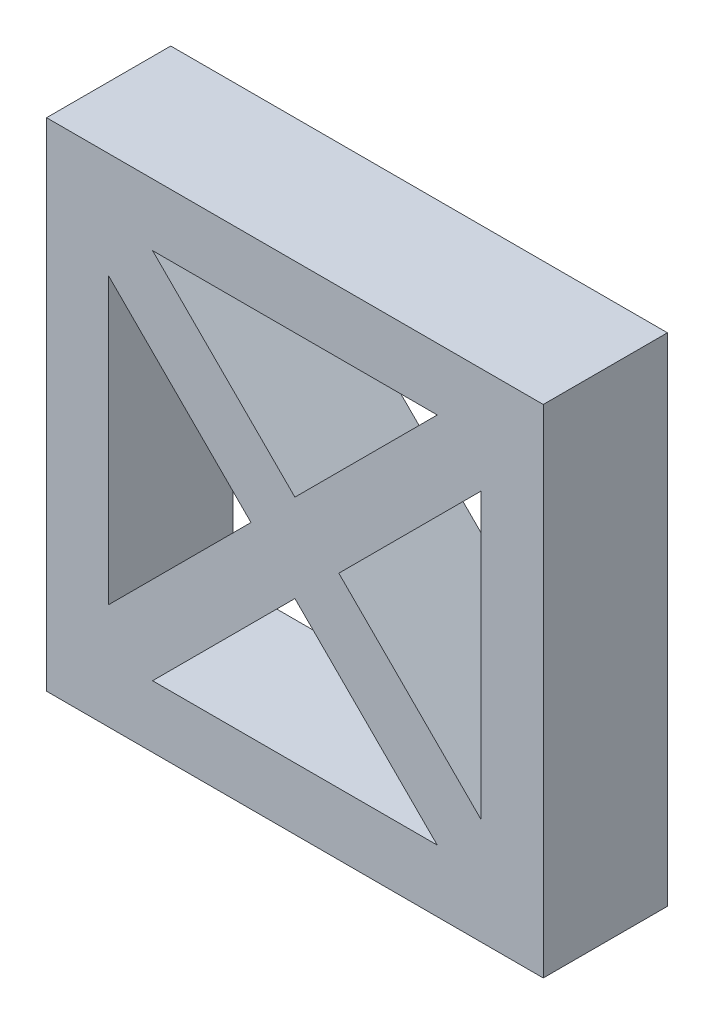
ISO-10303-21;
HEADER;
FILE_DESCRIPTION(('STEP AP214'),'2;1');
FILE_NAME('part.step','',(''),(''),'','','');
FILE_SCHEMA(('AUTOMOTIVE_DESIGN { 1 0 10303 214 1 1 1 1 }'));
ENDSEC;
DATA;
#1=APPLICATION_CONTEXT('core data for automotive mechanical design processes');
#2=APPLICATION_PROTOCOL_DEFINITION('international standard','automotive_design',2000,#1);
#3=PRODUCT_CONTEXT('',#1,'mechanical');
#4=PRODUCT('Part','Part','',(#3));
#5=PRODUCT_RELATED_PRODUCT_CATEGORY('part','',(#4));
#6=PRODUCT_DEFINITION_FORMATION('','',#4);
#7=PRODUCT_DEFINITION_CONTEXT('part definition',#1,'design');
#8=PRODUCT_DEFINITION('design','',#6,#7);
#9=PRODUCT_DEFINITION_SHAPE('','',#8);
#10=(LENGTH_UNIT() NAMED_UNIT(*) SI_UNIT(.MILLI.,.METRE.));
#11=(NAMED_UNIT(*) PLANE_ANGLE_UNIT() SI_UNIT($,.RADIAN.));
#12=(NAMED_UNIT(*) SI_UNIT($,.STERADIAN.) SOLID_ANGLE_UNIT());
#13=UNCERTAINTY_MEASURE_WITH_UNIT(LENGTH_MEASURE(1.E-05),#10,'distance_accuracy_value','');
#14=(GEOMETRIC_REPRESENTATION_CONTEXT(3) GLOBAL_UNCERTAINTY_ASSIGNED_CONTEXT((#13)) GLOBAL_UNIT_ASSIGNED_CONTEXT((#10,
#11,#12)) REPRESENTATION_CONTEXT('',''));
#15=CARTESIAN_POINT('',(0.,0.,0.));
#16=DIRECTION('',(0.,0.,1.));
#17=DIRECTION('',(1.,0.,0.));
#18=AXIS2_PLACEMENT_3D('',#15,#16,#17);
#19=CARTESIAN_POINT('',(0.,0.,10.));
#20=DIRECTION('',(0.,1.,0.));
#21=DIRECTION('',(0.,0.,1.));
#22=AXIS2_PLACEMENT_3D('',#19,#20,#21);
#23=PLANE('',#22);
#24=DIRECTION('',(1.,0.,0.));
#25=VECTOR('',#24,1.);
#26=CARTESIAN_POINT('',(0.,0.,0.));
#27=LINE('',#26,#25);
#28=CARTESIAN_POINT('',(0.,0.,0.));
#29=VERTEX_POINT('',#28);
#30=CARTESIAN_POINT('',(40.,0.,0.));
#31=VERTEX_POINT('',#30);
#32=EDGE_CURVE('E212',#29,#31,#27,.T.);
#33=ORIENTED_EDGE('',*,*,#32,.T.);
#34=DIRECTION('',(0.,0.,-1.));
#35=VECTOR('',#34,1.);
#36=CARTESIAN_POINT('',(40.,0.,10.));
#37=LINE('',#36,#35);
#38=CARTESIAN_POINT('',(40.,0.,10.));
#39=VERTEX_POINT('',#38);
#40=EDGE_CURVE('E11',#39,#31,#37,.T.);
#41=ORIENTED_EDGE('',*,*,#40,.F.);
#42=DIRECTION('',(1.,0.,0.));
#43=VECTOR('',#42,1.);
#44=CARTESIAN_POINT('',(0.,0.,10.));
#45=LINE('',#44,#43);
#46=CARTESIAN_POINT('',(0.,0.,10.));
#47=VERTEX_POINT('',#46);
#48=EDGE_CURVE('E160',#47,#39,#45,.T.);
#49=ORIENTED_EDGE('',*,*,#48,.F.);
#50=DIRECTION('',(0.,0.,-1.));
#51=VECTOR('',#50,1.);
#52=CARTESIAN_POINT('',(0.,0.,10.));
#53=LINE('',#52,#51);
#54=EDGE_CURVE('E52',#47,#29,#53,.T.);
#55=ORIENTED_EDGE('',*,*,#54,.T.);
#56=EDGE_LOOP('',(#33,#41,#49,#55));
#57=FACE_BOUND('',#56,.T.);
#58=ADVANCED_FACE('F33',(#57),#23,.F.);
#59=CARTESIAN_POINT('',(40.,0.,10.));
#60=DIRECTION('',(-1.,0.,0.));
#61=DIRECTION('',(0.,0.,1.));
#62=AXIS2_PLACEMENT_3D('',#59,#60,#61);
#63=PLANE('',#62);
#64=DIRECTION('',(0.,1.,0.));
#65=VECTOR('',#64,1.);
#66=CARTESIAN_POINT('',(40.,0.,0.));
#67=LINE('',#66,#65);
#68=CARTESIAN_POINT('',(40.,40.,0.));
#69=VERTEX_POINT('',#68);
#70=EDGE_CURVE('E166',#31,#69,#67,.T.);
#71=ORIENTED_EDGE('',*,*,#70,.T.);
#72=DIRECTION('',(0.,0.,-1.));
#73=VECTOR('',#72,1.);
#74=CARTESIAN_POINT('',(40.,40.,10.));
#75=LINE('',#74,#73);
#76=CARTESIAN_POINT('',(40.,40.,10.));
#77=VERTEX_POINT('',#76);
#78=EDGE_CURVE('E43',#77,#69,#75,.T.);
#79=ORIENTED_EDGE('',*,*,#78,.F.);
#80=DIRECTION('',(0.,1.,0.));
#81=VECTOR('',#80,1.);
#82=CARTESIAN_POINT('',(40.,0.,10.));
#83=LINE('',#82,#81);
#84=EDGE_CURVE('E154',#39,#77,#83,.T.);
#85=ORIENTED_EDGE('',*,*,#84,.F.);
#86=ORIENTED_EDGE('',*,*,#40,.T.);
#87=EDGE_LOOP('',(#71,#79,#85,#86));
#88=FACE_BOUND('',#87,.T.);
#89=ADVANCED_FACE('F165',(#88),#63,.F.);
#90=CARTESIAN_POINT('',(0.,40.,10.));
#91=DIRECTION('',(0.,1.,0.));
#92=DIRECTION('',(0.,0.,1.));
#93=AXIS2_PLACEMENT_3D('',#90,#91,#92);
#94=PLANE('',#93);
#95=DIRECTION('',(1.,0.,0.));
#96=VECTOR('',#95,1.);
#97=CARTESIAN_POINT('',(0.,40.,0.));
#98=LINE('',#97,#96);
#99=CARTESIAN_POINT('',(0.,40.,0.));
#100=VERTEX_POINT('',#99);
#101=EDGE_CURVE('E215',#100,#69,#98,.T.);
#102=ORIENTED_EDGE('',*,*,#101,.F.);
#103=DIRECTION('',(0.,0.,-1.));
#104=VECTOR('',#103,1.);
#105=CARTESIAN_POINT('',(0.,40.,10.));
#106=LINE('',#105,#104);
#107=CARTESIAN_POINT('',(0.,40.,10.));
#108=VERTEX_POINT('',#107);
#109=EDGE_CURVE('E102',#108,#100,#106,.T.);
#110=ORIENTED_EDGE('',*,*,#109,.F.);
#111=DIRECTION('',(1.,0.,0.));
#112=VECTOR('',#111,1.);
#113=CARTESIAN_POINT('',(0.,40.,10.));
#114=LINE('',#113,#112);
#115=EDGE_CURVE('E159',#108,#77,#114,.T.);
#116=ORIENTED_EDGE('',*,*,#115,.T.);
#117=ORIENTED_EDGE('',*,*,#78,.T.);
#118=EDGE_LOOP('',(#102,#110,#116,#117));
#119=FACE_BOUND('',#118,.T.);
#120=ADVANCED_FACE('F170',(#119),#94,.T.);
#121=CARTESIAN_POINT('',(18.2322330470336,18.2322330470336,10.));
#122=DIRECTION('',(0.707106781186547,0.707106781186548,0.));
#123=DIRECTION('',(-0.707106781186548,0.707106781186547,0.));
#124=AXIS2_PLACEMENT_3D('',#121,#122,#123);
#125=PLANE('',#124);
#126=DIRECTION('',(0.707106781186548,-0.707106781186547,0.));
#127=VECTOR('',#126,1.);
#128=CARTESIAN_POINT('',(18.2322330470336,18.2322330470336,0.));
#129=LINE('',#128,#127);
#130=CARTESIAN_POINT('',(4.99999999999999,31.4644660940673,0.));
#131=VERTEX_POINT('',#130);
#132=CARTESIAN_POINT('',(16.4644660940673,20.,0.));
#133=VERTEX_POINT('',#132);
#134=EDGE_CURVE('E203',#131,#133,#129,.T.);
#135=ORIENTED_EDGE('',*,*,#134,.T.);
#136=DIRECTION('',(0.,0.,-1.));
#137=VECTOR('',#136,1.);
#138=CARTESIAN_POINT('',(16.4644660940673,20.,10.));
#139=LINE('',#138,#137);
#140=CARTESIAN_POINT('',(16.4644660940673,20.,10.));
#141=VERTEX_POINT('',#140);
#142=EDGE_CURVE('E222',#141,#133,#139,.T.);
#143=ORIENTED_EDGE('',*,*,#142,.F.);
#144=DIRECTION('',(0.707106781186548,-0.707106781186547,0.));
#145=VECTOR('',#144,1.);
#146=CARTESIAN_POINT('',(18.2322330470336,18.2322330470336,10.));
#147=LINE('',#146,#145);
#148=CARTESIAN_POINT('',(4.99999999999999,31.4644660940673,10.));
#149=VERTEX_POINT('',#148);
#150=EDGE_CURVE('E279',#149,#141,#147,.T.);
#151=ORIENTED_EDGE('',*,*,#150,.F.);
#152=DIRECTION('',(0.,0.,-1.));
#153=VECTOR('',#152,1.);
#154=CARTESIAN_POINT('',(4.99999999999999,31.4644660940673,10.));
#155=LINE('',#154,#153);
#156=EDGE_CURVE('E224',#149,#131,#155,.T.);
#157=ORIENTED_EDGE('',*,*,#156,.T.);
#158=EDGE_LOOP('',(#135,#143,#151,#157));
#159=FACE_BOUND('',#158,.T.);
#160=ADVANCED_FACE('F300',(#159),#125,.F.);
#161=CARTESIAN_POINT('',(-1.76776695296637,1.76776695296637,10.));
#162=DIRECTION('',(0.707106781186548,-0.707106781186548,0.));
#163=DIRECTION('',(0.707106781186548,0.707106781186548,0.));
#164=AXIS2_PLACEMENT_3D('',#161,#162,#163);
#165=PLANE('',#164);
#166=DIRECTION('',(-0.707106781186548,-0.707106781186548,0.));
#167=VECTOR('',#166,1.);
#168=CARTESIAN_POINT('',(-1.76776695296637,1.76776695296637,0.));
#169=LINE('',#168,#167);
#170=CARTESIAN_POINT('',(4.99999999999999,8.53553390593273,0.));
#171=VERTEX_POINT('',#170);
#172=EDGE_CURVE('E206',#133,#171,#169,.T.);
#173=ORIENTED_EDGE('',*,*,#172,.T.);
#174=DIRECTION('',(0.,0.,-1.));
#175=VECTOR('',#174,1.);
#176=CARTESIAN_POINT('',(4.99999999999999,8.53553390593273,10.));
#177=LINE('',#176,#175);
#178=CARTESIAN_POINT('',(4.99999999999999,8.53553390593273,10.));
#179=VERTEX_POINT('',#178);
#180=EDGE_CURVE('E226',#179,#171,#177,.T.);
#181=ORIENTED_EDGE('',*,*,#180,.F.);
#182=DIRECTION('',(-0.707106781186548,-0.707106781186548,0.));
#183=VECTOR('',#182,1.);
#184=CARTESIAN_POINT('',(-1.76776695296637,1.76776695296637,10.));
#185=LINE('',#184,#183);
#186=EDGE_CURVE('E282',#141,#179,#185,.T.);
#187=ORIENTED_EDGE('',*,*,#186,.F.);
#188=ORIENTED_EDGE('',*,*,#142,.T.);
#189=EDGE_LOOP('',(#173,#181,#187,#188));
#190=FACE_BOUND('',#189,.T.);
#191=ADVANCED_FACE('F295',(#190),#165,.F.);
#192=CARTESIAN_POINT('',(-1.76776695296637,1.76776695296637,10.));
#193=DIRECTION('',(0.707106781186548,-0.707106781186548,0.));
#194=DIRECTION('',(0.707106781186548,0.707106781186548,0.));
#195=AXIS2_PLACEMENT_3D('',#192,#193,#194);
#196=PLANE('',#195);
#197=DIRECTION('',(-0.707106781186548,-0.707106781186548,0.));
#198=VECTOR('',#197,1.);
#199=CARTESIAN_POINT('',(-1.76776695296637,1.76776695296637,0.));
#200=LINE('',#199,#198);
#201=CARTESIAN_POINT('',(31.4644660940673,35.,0.));
#202=VERTEX_POINT('',#201);
#203=CARTESIAN_POINT('',(20.,23.5355339059327,0.));
#204=VERTEX_POINT('',#203);
#205=EDGE_CURVE('E195',#202,#204,#200,.T.);
#206=ORIENTED_EDGE('',*,*,#205,.T.);
#207=DIRECTION('',(0.,0.,-1.));
#208=VECTOR('',#207,1.);
#209=CARTESIAN_POINT('',(20.,23.5355339059327,10.));
#210=LINE('',#209,#208);
#211=CARTESIAN_POINT('',(20.,23.5355339059327,10.));
#212=VERTEX_POINT('',#211);
#213=EDGE_CURVE('E227',#212,#204,#210,.T.);
#214=ORIENTED_EDGE('',*,*,#213,.F.);
#215=DIRECTION('',(-0.707106781186548,-0.707106781186548,0.));
#216=VECTOR('',#215,1.);
#217=CARTESIAN_POINT('',(-1.76776695296637,1.76776695296637,10.));
#218=LINE('',#217,#216);
#219=CARTESIAN_POINT('',(31.4644660940673,35.,10.));
#220=VERTEX_POINT('',#219);
#221=EDGE_CURVE('E272',#220,#212,#218,.T.);
#222=ORIENTED_EDGE('',*,*,#221,.F.);
#223=DIRECTION('',(0.,0.,-1.));
#224=VECTOR('',#223,1.);
#225=CARTESIAN_POINT('',(31.4644660940673,35.,10.));
#226=LINE('',#225,#224);
#227=EDGE_CURVE('E231',#220,#202,#226,.T.);
#228=ORIENTED_EDGE('',*,*,#227,.T.);
#229=EDGE_LOOP('',(#206,#214,#222,#228));
#230=FACE_BOUND('',#229,.T.);
#231=ADVANCED_FACE('F307',(#230),#196,.F.);
#232=CARTESIAN_POINT('',(21.7677669529664,21.7677669529664,10.));
#233=DIRECTION('',(0.707106781186547,0.707106781186548,0.));
#234=DIRECTION('',(-0.707106781186548,0.707106781186547,0.));
#235=AXIS2_PLACEMENT_3D('',#232,#233,#234);
#236=PLANE('',#235);
#237=DIRECTION('',(0.707106781186548,-0.707106781186547,0.));
#238=VECTOR('',#237,1.);
#239=CARTESIAN_POINT('',(21.7677669529664,21.7677669529664,0.));
#240=LINE('',#239,#238);
#241=CARTESIAN_POINT('',(8.53553390593273,35.,0.));
#242=VERTEX_POINT('',#241);
#243=EDGE_CURVE('E198',#242,#204,#240,.T.);
#244=ORIENTED_EDGE('',*,*,#243,.F.);
#245=DIRECTION('',(0.,0.,-1.));
#246=VECTOR('',#245,1.);
#247=CARTESIAN_POINT('',(8.53553390593273,35.,10.));
#248=LINE('',#247,#246);
#249=CARTESIAN_POINT('',(8.53553390593273,35.,10.));
#250=VERTEX_POINT('',#249);
#251=EDGE_CURVE('E234',#250,#242,#248,.T.);
#252=ORIENTED_EDGE('',*,*,#251,.F.);
#253=DIRECTION('',(0.707106781186548,-0.707106781186547,0.));
#254=VECTOR('',#253,1.);
#255=CARTESIAN_POINT('',(21.7677669529664,21.7677669529664,10.));
#256=LINE('',#255,#254);
#257=EDGE_CURVE('E274',#250,#212,#256,.T.);
#258=ORIENTED_EDGE('',*,*,#257,.T.);
#259=ORIENTED_EDGE('',*,*,#213,.T.);
#260=EDGE_LOOP('',(#244,#252,#258,#259));
#261=FACE_BOUND('',#260,.T.);
#262=ADVANCED_FACE('F337',(#261),#236,.T.);
#263=CARTESIAN_POINT('',(1.76776695296637,-1.76776695296637,10.));
#264=DIRECTION('',(0.707106781186548,-0.707106781186548,0.));
#265=DIRECTION('',(0.707106781186548,0.707106781186548,0.));
#266=AXIS2_PLACEMENT_3D('',#263,#264,#265);
#267=PLANE('',#266);
#268=DIRECTION('',(-0.707106781186548,-0.707106781186548,0.));
#269=VECTOR('',#268,1.);
#270=CARTESIAN_POINT('',(1.76776695296637,-1.76776695296637,0.));
#271=LINE('',#270,#269);
#272=CARTESIAN_POINT('',(20.,16.4644660940673,0.));
#273=VERTEX_POINT('',#272);
#274=CARTESIAN_POINT('',(8.53553390593273,4.99999999999999,0.));
#275=VERTEX_POINT('',#274);
#276=EDGE_CURVE('E186',#273,#275,#271,.T.);
#277=ORIENTED_EDGE('',*,*,#276,.F.);
#278=DIRECTION('',(0.,0.,-1.));
#279=VECTOR('',#278,1.);
#280=CARTESIAN_POINT('',(20.,16.4644660940673,10.));
#281=LINE('',#280,#279);
#282=CARTESIAN_POINT('',(20.,16.4644660940673,10.));
#283=VERTEX_POINT('',#282);
#284=EDGE_CURVE('E235',#283,#273,#281,.T.);
#285=ORIENTED_EDGE('',*,*,#284,.F.);
#286=DIRECTION('',(-0.707106781186548,-0.707106781186548,0.));
#287=VECTOR('',#286,1.);
#288=CARTESIAN_POINT('',(1.76776695296637,-1.76776695296637,10.));
#289=LINE('',#288,#287);
#290=CARTESIAN_POINT('',(8.53553390593273,4.99999999999999,10.));
#291=VERTEX_POINT('',#290);
#292=EDGE_CURVE('E264',#283,#291,#289,.T.);
#293=ORIENTED_EDGE('',*,*,#292,.T.);
#294=DIRECTION('',(0.,0.,-1.));
#295=VECTOR('',#294,1.);
#296=CARTESIAN_POINT('',(8.53553390593273,4.99999999999999,10.));
#297=LINE('',#296,#295);
#298=EDGE_CURVE('E238',#291,#275,#297,.T.);
#299=ORIENTED_EDGE('',*,*,#298,.T.);
#300=EDGE_LOOP('',(#277,#285,#293,#299));
#301=FACE_BOUND('',#300,.T.);
#302=ADVANCED_FACE('F334',(#301),#267,.T.);
#303=CARTESIAN_POINT('',(18.2322330470336,18.2322330470336,10.));
#304=DIRECTION('',(0.707106781186547,0.707106781186548,0.));
#305=DIRECTION('',(-0.707106781186548,0.707106781186547,0.));
#306=AXIS2_PLACEMENT_3D('',#303,#304,#305);
#307=PLANE('',#306);
#308=DIRECTION('',(0.707106781186548,-0.707106781186547,0.));
#309=VECTOR('',#308,1.);
#310=CARTESIAN_POINT('',(18.2322330470336,18.2322330470336,0.));
#311=LINE('',#310,#309);
#312=CARTESIAN_POINT('',(31.4644660940673,4.99999999999999,0.));
#313=VERTEX_POINT('',#312);
#314=EDGE_CURVE('E189',#273,#313,#311,.T.);
#315=ORIENTED_EDGE('',*,*,#314,.T.);
#316=DIRECTION('',(0.,0.,-1.));
#317=VECTOR('',#316,1.);
#318=CARTESIAN_POINT('',(31.4644660940673,4.99999999999999,10.));
#319=LINE('',#318,#317);
#320=CARTESIAN_POINT('',(31.4644660940673,4.99999999999999,10.));
#321=VERTEX_POINT('',#320);
#322=EDGE_CURVE('E240',#321,#313,#319,.T.);
#323=ORIENTED_EDGE('',*,*,#322,.F.);
#324=DIRECTION('',(0.707106781186548,-0.707106781186547,0.));
#325=VECTOR('',#324,1.);
#326=CARTESIAN_POINT('',(18.2322330470336,18.2322330470336,10.));
#327=LINE('',#326,#325);
#328=EDGE_CURVE('E267',#283,#321,#327,.T.);
#329=ORIENTED_EDGE('',*,*,#328,.F.);
#330=ORIENTED_EDGE('',*,*,#284,.T.);
#331=EDGE_LOOP('',(#315,#323,#329,#330));
#332=FACE_BOUND('',#331,.T.);
#333=ADVANCED_FACE('F329',(#332),#307,.F.);
#334=CARTESIAN_POINT('',(21.7677669529664,21.7677669529664,10.));
#335=DIRECTION('',(0.707106781186547,0.707106781186548,0.));
#336=DIRECTION('',(-0.707106781186548,0.707106781186547,0.));
#337=AXIS2_PLACEMENT_3D('',#334,#335,#336);
#338=PLANE('',#337);
#339=DIRECTION('',(0.707106781186548,-0.707106781186547,0.));
#340=VECTOR('',#339,1.);
#341=CARTESIAN_POINT('',(21.7677669529664,21.7677669529664,0.));
#342=LINE('',#341,#340);
#343=CARTESIAN_POINT('',(23.5355339059327,20.,0.));
#344=VERTEX_POINT('',#343);
#345=CARTESIAN_POINT('',(35.,8.53553390593273,0.));
#346=VERTEX_POINT('',#345);
#347=EDGE_CURVE('E177',#344,#346,#342,.T.);
#348=ORIENTED_EDGE('',*,*,#347,.F.);
#349=DIRECTION('',(0.,0.,-1.));
#350=VECTOR('',#349,1.);
#351=CARTESIAN_POINT('',(23.5355339059327,20.,10.));
#352=LINE('',#351,#350);
#353=CARTESIAN_POINT('',(23.5355339059327,20.,10.));
#354=VERTEX_POINT('',#353);
#355=EDGE_CURVE('E37',#354,#344,#352,.T.);
#356=ORIENTED_EDGE('',*,*,#355,.F.);
#357=DIRECTION('',(0.707106781186548,-0.707106781186547,0.));
#358=VECTOR('',#357,1.);
#359=CARTESIAN_POINT('',(21.7677669529664,21.7677669529664,10.));
#360=LINE('',#359,#358);
#361=CARTESIAN_POINT('',(35.,8.53553390593273,10.));
#362=VERTEX_POINT('',#361);
#363=EDGE_CURVE('E220',#354,#362,#360,.T.);
#364=ORIENTED_EDGE('',*,*,#363,.T.);
#365=DIRECTION('',(0.,0.,-1.));
#366=VECTOR('',#365,1.);
#367=CARTESIAN_POINT('',(35.,8.53553390593273,10.));
#368=LINE('',#367,#366);
#369=EDGE_CURVE('E173',#362,#346,#368,.T.);
#370=ORIENTED_EDGE('',*,*,#369,.T.);
#371=EDGE_LOOP('',(#348,#356,#364,#370));
#372=FACE_BOUND('',#371,.T.);
#373=ADVANCED_FACE('F35',(#372),#338,.T.);
#374=CARTESIAN_POINT('',(1.76776695296637,-1.76776695296637,10.));
#375=DIRECTION('',(0.707106781186548,-0.707106781186548,0.));
#376=DIRECTION('',(0.707106781186548,0.707106781186548,0.));
#377=AXIS2_PLACEMENT_3D('',#374,#375,#376);
#378=PLANE('',#377);
#379=DIRECTION('',(-0.707106781186548,-0.707106781186548,0.));
#380=VECTOR('',#379,1.);
#381=CARTESIAN_POINT('',(1.76776695296637,-1.76776695296637,0.));
#382=LINE('',#381,#380);
#383=CARTESIAN_POINT('',(35.,31.4644660940673,0.));
#384=VERTEX_POINT('',#383);
#385=EDGE_CURVE('E180',#384,#344,#382,.T.);
#386=ORIENTED_EDGE('',*,*,#385,.F.);
#387=DIRECTION('',(0.,0.,-1.));
#388=VECTOR('',#387,1.);
#389=CARTESIAN_POINT('',(35.,31.4644660940673,10.));
#390=LINE('',#389,#388);
#391=CARTESIAN_POINT('',(35.,31.4644660940673,10.));
#392=VERTEX_POINT('',#391);
#393=EDGE_CURVE('E243',#392,#384,#390,.T.);
#394=ORIENTED_EDGE('',*,*,#393,.F.);
#395=DIRECTION('',(-0.707106781186548,-0.707106781186548,0.));
#396=VECTOR('',#395,1.);
#397=CARTESIAN_POINT('',(1.76776695296637,-1.76776695296637,10.));
#398=LINE('',#397,#396);
#399=EDGE_CURVE('E252',#392,#354,#398,.T.);
#400=ORIENTED_EDGE('',*,*,#399,.T.);
#401=ORIENTED_EDGE('',*,*,#355,.T.);
#402=EDGE_LOOP('',(#386,#394,#400,#401));
#403=FACE_BOUND('',#402,.T.);
#404=ADVANCED_FACE('F250',(#403),#378,.T.);
#405=CARTESIAN_POINT('',(4.99999999999999,0.,10.));
#406=DIRECTION('',(1.,0.,0.));
#407=DIRECTION('',(0.,0.,-1.));
#408=AXIS2_PLACEMENT_3D('',#405,#406,#407);
#409=PLANE('',#408);
#410=DIRECTION('',(0.,-1.,0.));
#411=VECTOR('',#410,1.);
#412=CARTESIAN_POINT('',(4.99999999999999,0.,0.));
#413=LINE('',#412,#411);
#414=EDGE_CURVE('E209',#131,#171,#413,.T.);
#415=ORIENTED_EDGE('',*,*,#414,.F.);
#416=ORIENTED_EDGE('',*,*,#156,.F.);
#417=DIRECTION('',(0.,-1.,0.));
#418=VECTOR('',#417,1.);
#419=CARTESIAN_POINT('',(4.99999999999999,0.,10.));
#420=LINE('',#419,#418);
#421=EDGE_CURVE('E284',#149,#179,#420,.T.);
#422=ORIENTED_EDGE('',*,*,#421,.T.);
#423=ORIENTED_EDGE('',*,*,#180,.T.);
#424=EDGE_LOOP('',(#415,#416,#422,#423));
#425=FACE_BOUND('',#424,.T.);
#426=ADVANCED_FACE('F289',(#425),#409,.T.);
#427=CARTESIAN_POINT('',(0.,35.,10.));
#428=DIRECTION('',(0.,1.,0.));
#429=DIRECTION('',(0.,0.,1.));
#430=AXIS2_PLACEMENT_3D('',#427,#428,#429);
#431=PLANE('',#430);
#432=DIRECTION('',(1.,0.,0.));
#433=VECTOR('',#432,1.);
#434=CARTESIAN_POINT('',(0.,35.,0.));
#435=LINE('',#434,#433);
#436=EDGE_CURVE('E201',#242,#202,#435,.T.);
#437=ORIENTED_EDGE('',*,*,#436,.T.);
#438=ORIENTED_EDGE('',*,*,#227,.F.);
#439=DIRECTION('',(1.,0.,0.));
#440=VECTOR('',#439,1.);
#441=CARTESIAN_POINT('',(0.,35.,10.));
#442=LINE('',#441,#440);
#443=EDGE_CURVE('E277',#250,#220,#442,.T.);
#444=ORIENTED_EDGE('',*,*,#443,.F.);
#445=ORIENTED_EDGE('',*,*,#251,.T.);
#446=EDGE_LOOP('',(#437,#438,#444,#445));
#447=FACE_BOUND('',#446,.T.);
#448=ADVANCED_FACE('F319',(#447),#431,.F.);
#449=CARTESIAN_POINT('',(0.,4.99999999999999,10.));
#450=DIRECTION('',(0.,1.,0.));
#451=DIRECTION('',(0.,0.,1.));
#452=AXIS2_PLACEMENT_3D('',#449,#450,#451);
#453=PLANE('',#452);
#454=DIRECTION('',(1.,0.,0.));
#455=VECTOR('',#454,1.);
#456=CARTESIAN_POINT('',(0.,4.99999999999999,0.));
#457=LINE('',#456,#455);
#458=EDGE_CURVE('E192',#275,#313,#457,.T.);
#459=ORIENTED_EDGE('',*,*,#458,.F.);
#460=ORIENTED_EDGE('',*,*,#298,.F.);
#461=DIRECTION('',(1.,0.,0.));
#462=VECTOR('',#461,1.);
#463=CARTESIAN_POINT('',(0.,4.99999999999999,10.));
#464=LINE('',#463,#462);
#465=EDGE_CURVE('E269',#291,#321,#464,.T.);
#466=ORIENTED_EDGE('',*,*,#465,.T.);
#467=ORIENTED_EDGE('',*,*,#322,.T.);
#468=EDGE_LOOP('',(#459,#460,#466,#467));
#469=FACE_BOUND('',#468,.T.);
#470=ADVANCED_FACE('F324',(#469),#453,.T.);
#471=CARTESIAN_POINT('',(35.,0.,10.));
#472=DIRECTION('',(1.,0.,0.));
#473=DIRECTION('',(0.,0.,-1.));
#474=AXIS2_PLACEMENT_3D('',#471,#472,#473);
#475=PLANE('',#474);
#476=DIRECTION('',(0.,-1.,0.));
#477=VECTOR('',#476,1.);
#478=CARTESIAN_POINT('',(35.,0.,0.));
#479=LINE('',#478,#477);
#480=EDGE_CURVE('E183',#384,#346,#479,.T.);
#481=ORIENTED_EDGE('',*,*,#480,.T.);
#482=ORIENTED_EDGE('',*,*,#369,.F.);
#483=DIRECTION('',(0.,-1.,0.));
#484=VECTOR('',#483,1.);
#485=CARTESIAN_POINT('',(35.,0.,10.));
#486=LINE('',#485,#484);
#487=EDGE_CURVE('E258',#392,#362,#486,.T.);
#488=ORIENTED_EDGE('',*,*,#487,.F.);
#489=ORIENTED_EDGE('',*,*,#393,.T.);
#490=EDGE_LOOP('',(#481,#482,#488,#489));
#491=FACE_BOUND('',#490,.T.);
#492=ADVANCED_FACE('F257',(#491),#475,.F.);
#493=CARTESIAN_POINT('',(0.,0.,10.));
#494=DIRECTION('',(-1.,0.,0.));
#495=DIRECTION('',(0.,0.,1.));
#496=AXIS2_PLACEMENT_3D('',#493,#494,#495);
#497=PLANE('',#496);
#498=DIRECTION('',(0.,1.,0.));
#499=VECTOR('',#498,1.);
#500=CARTESIAN_POINT('',(0.,0.,0.));
#501=LINE('',#500,#499);
#502=EDGE_CURVE('E217',#29,#100,#501,.T.);
#503=ORIENTED_EDGE('',*,*,#502,.F.);
#504=ORIENTED_EDGE('',*,*,#54,.F.);
#505=DIRECTION('',(0.,1.,0.));
#506=VECTOR('',#505,1.);
#507=CARTESIAN_POINT('',(0.,0.,10.));
#508=LINE('',#507,#506);
#509=EDGE_CURVE('E171',#47,#108,#508,.T.);
#510=ORIENTED_EDGE('',*,*,#509,.T.);
#511=ORIENTED_EDGE('',*,*,#109,.T.);
#512=EDGE_LOOP('',(#503,#504,#510,#511));
#513=FACE_BOUND('',#512,.T.);
#514=ADVANCED_FACE('F333',(#513),#497,.T.);
#515=CARTESIAN_POINT('',(0.,0.,10.));
#516=DIRECTION('',(0.,0.,1.));
#517=DIRECTION('',(1.,0.,0.));
#518=AXIS2_PLACEMENT_3D('',#515,#516,#517);
#519=PLANE('',#518);
#520=ORIENTED_EDGE('',*,*,#363,.F.);
#521=ORIENTED_EDGE('',*,*,#399,.F.);
#522=ORIENTED_EDGE('',*,*,#487,.T.);
#523=EDGE_LOOP('',(#520,#521,#522));
#524=FACE_BOUND('',#523,.T.);
#525=ORIENTED_EDGE('',*,*,#292,.F.);
#526=ORIENTED_EDGE('',*,*,#328,.T.);
#527=ORIENTED_EDGE('',*,*,#465,.F.);
#528=EDGE_LOOP('',(#525,#526,#527));
#529=FACE_BOUND('',#528,.T.);
#530=ORIENTED_EDGE('',*,*,#221,.T.);
#531=ORIENTED_EDGE('',*,*,#257,.F.);
#532=ORIENTED_EDGE('',*,*,#443,.T.);
#533=EDGE_LOOP('',(#530,#531,#532));
#534=FACE_BOUND('',#533,.T.);
#535=ORIENTED_EDGE('',*,*,#150,.T.);
#536=ORIENTED_EDGE('',*,*,#186,.T.);
#537=ORIENTED_EDGE('',*,*,#421,.F.);
#538=EDGE_LOOP('',(#535,#536,#537));
#539=FACE_BOUND('',#538,.T.);
#540=ORIENTED_EDGE('',*,*,#48,.T.);
#541=ORIENTED_EDGE('',*,*,#84,.T.);
#542=ORIENTED_EDGE('',*,*,#115,.F.);
#543=ORIENTED_EDGE('',*,*,#509,.F.);
#544=EDGE_LOOP('',(#540,#541,#542,#543));
#545=FACE_BOUND('',#544,.T.);
#546=ADVANCED_FACE('F156',(#524,#529,#534,#539,#545),#519,.T.);
#547=CARTESIAN_POINT('',(0.,0.,0.));
#548=DIRECTION('',(0.,0.,1.));
#549=DIRECTION('',(1.,0.,0.));
#550=AXIS2_PLACEMENT_3D('',#547,#548,#549);
#551=PLANE('',#550);
#552=ORIENTED_EDGE('',*,*,#347,.T.);
#553=ORIENTED_EDGE('',*,*,#480,.F.);
#554=ORIENTED_EDGE('',*,*,#385,.T.);
#555=EDGE_LOOP('',(#552,#553,#554));
#556=FACE_BOUND('',#555,.T.);
#557=ORIENTED_EDGE('',*,*,#276,.T.);
#558=ORIENTED_EDGE('',*,*,#458,.T.);
#559=ORIENTED_EDGE('',*,*,#314,.F.);
#560=EDGE_LOOP('',(#557,#558,#559));
#561=FACE_BOUND('',#560,.T.);
#562=ORIENTED_EDGE('',*,*,#205,.F.);
#563=ORIENTED_EDGE('',*,*,#436,.F.);
#564=ORIENTED_EDGE('',*,*,#243,.T.);
#565=EDGE_LOOP('',(#562,#563,#564));
#566=FACE_BOUND('',#565,.T.);
#567=ORIENTED_EDGE('',*,*,#134,.F.);
#568=ORIENTED_EDGE('',*,*,#414,.T.);
#569=ORIENTED_EDGE('',*,*,#172,.F.);
#570=EDGE_LOOP('',(#567,#568,#569));
#571=FACE_BOUND('',#570,.T.);
#572=ORIENTED_EDGE('',*,*,#32,.F.);
#573=ORIENTED_EDGE('',*,*,#502,.T.);
#574=ORIENTED_EDGE('',*,*,#101,.T.);
#575=ORIENTED_EDGE('',*,*,#70,.F.);
#576=EDGE_LOOP('',(#572,#573,#574,#575));
#577=FACE_BOUND('',#576,.T.);
#578=ADVANCED_FACE('F255',(#556,#561,#566,#571,#577),#551,.F.);
#579=CLOSED_SHELL('',(#58,#89,#120,#160,#191,#231,#262,#302,#333,#373,#404,#426,#448,#470,#492,
#514,#546,#578));
#580=MANIFOLD_SOLID_BREP('B2',#579);
#581=ADVANCED_BREP_SHAPE_REPRESENTATION('',(#18,#580),#14);
#582=SHAPE_DEFINITION_REPRESENTATION(#9,#581);
ENDSEC;
END-ISO-10303-21;
